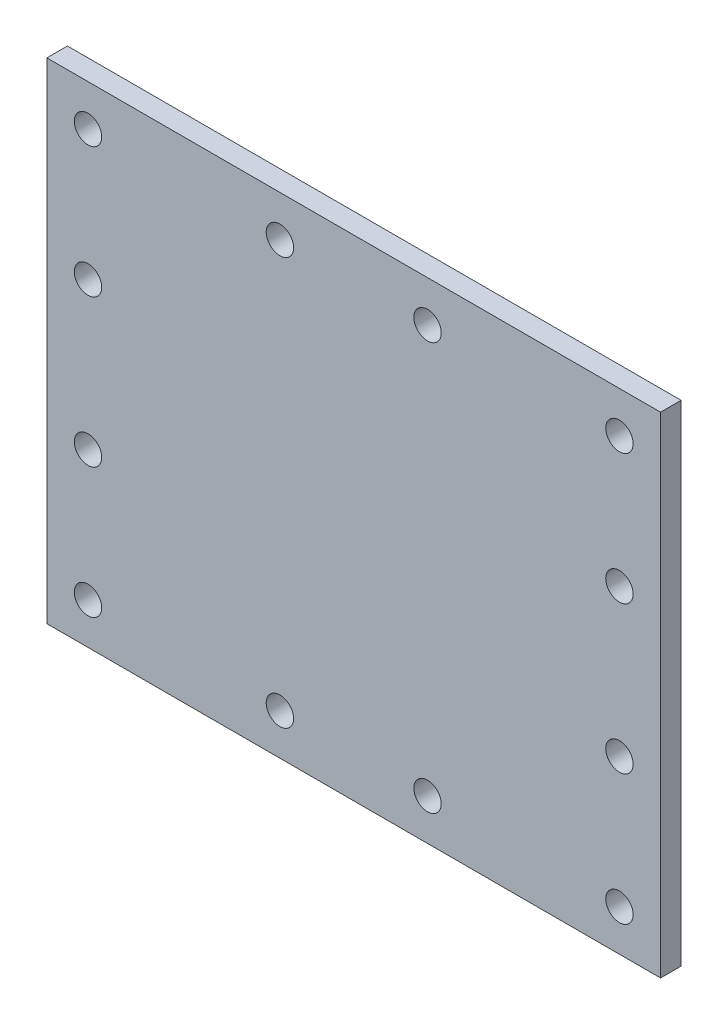
ISO-10303-21;
HEADER;
FILE_DESCRIPTION(('STEP AP214'),'2;1');
FILE_NAME('part.step','',(''),(''),'','','');
FILE_SCHEMA(('AUTOMOTIVE_DESIGN { 1 0 10303 214 1 1 1 1 }'));
ENDSEC;
DATA;
#1=APPLICATION_CONTEXT('core data for automotive mechanical design processes');
#2=APPLICATION_PROTOCOL_DEFINITION('international standard','automotive_design',2000,#1);
#3=PRODUCT_CONTEXT('',#1,'mechanical');
#4=PRODUCT('Part','Part','',(#3));
#5=PRODUCT_RELATED_PRODUCT_CATEGORY('part','',(#4));
#6=PRODUCT_DEFINITION_FORMATION('','',#4);
#7=PRODUCT_DEFINITION_CONTEXT('part definition',#1,'design');
#8=PRODUCT_DEFINITION('design','',#6,#7);
#9=PRODUCT_DEFINITION_SHAPE('','',#8);
#10=(LENGTH_UNIT() NAMED_UNIT(*) SI_UNIT(.MILLI.,.METRE.));
#11=(NAMED_UNIT(*) PLANE_ANGLE_UNIT() SI_UNIT($,.RADIAN.));
#12=(NAMED_UNIT(*) SI_UNIT($,.STERADIAN.) SOLID_ANGLE_UNIT());
#13=UNCERTAINTY_MEASURE_WITH_UNIT(LENGTH_MEASURE(1.E-05),#10,'distance_accuracy_value','');
#14=(GEOMETRIC_REPRESENTATION_CONTEXT(3) GLOBAL_UNCERTAINTY_ASSIGNED_CONTEXT((#13)) GLOBAL_UNIT_ASSIGNED_CONTEXT((#10,
#11,#12)) REPRESENTATION_CONTEXT('',''));
#15=CARTESIAN_POINT('',(0.,0.,0.));
#16=DIRECTION('',(0.,0.,1.));
#17=DIRECTION('',(1.,0.,0.));
#18=AXIS2_PLACEMENT_3D('',#15,#16,#17);
#19=CARTESIAN_POINT('',(-146.664312824647,106.741954424767,-2.51040500289528));
#20=DIRECTION('',(0.,1.,0.));
#21=DIRECTION('',(-1.,0.,0.));
#22=AXIS2_PLACEMENT_3D('',#19,#20,#21);
#23=PLANE('',#22);
#24=DIRECTION('',(1.,0.,0.));
#25=VECTOR('',#24,1.);
#26=CARTESIAN_POINT('',(-146.664312824647,106.741954424767,-5.51040500289528));
#27=LINE('',#26,#25);
#28=CARTESIAN_POINT('',(-146.664312824647,106.741954424767,-5.51040500289528));
#29=VERTEX_POINT('',#28);
#30=CARTESIAN_POINT('',(-57.1243128246472,106.741954424767,-5.51040500289528));
#31=VERTEX_POINT('',#30);
#32=EDGE_CURVE('E100',#29,#31,#27,.T.);
#33=ORIENTED_EDGE('',*,*,#32,.F.);
#34=DIRECTION('',(0.,0.,-1.));
#35=VECTOR('',#34,1.);
#36=CARTESIAN_POINT('',(-146.664312824647,106.741954424767,-2.51040500289528));
#37=LINE('',#36,#35);
#38=CARTESIAN_POINT('',(-146.664312824647,106.741954424767,-2.51040500289528));
#39=VERTEX_POINT('',#38);
#40=EDGE_CURVE('E11',#39,#29,#37,.T.);
#41=ORIENTED_EDGE('',*,*,#40,.F.);
#42=DIRECTION('',(1.,0.,0.));
#43=VECTOR('',#42,1.);
#44=CARTESIAN_POINT('',(-146.664312824647,106.741954424767,-2.51040500289528));
#45=LINE('',#44,#43);
#46=CARTESIAN_POINT('',(-57.1243128246472,106.741954424767,-2.51040500289528));
#47=VERTEX_POINT('',#46);
#48=EDGE_CURVE('E93',#39,#47,#45,.T.);
#49=ORIENTED_EDGE('',*,*,#48,.T.);
#50=DIRECTION('',(0.,0.,-1.));
#51=VECTOR('',#50,1.);
#52=CARTESIAN_POINT('',(-57.1243128246472,106.741954424767,-2.51040500289528));
#53=LINE('',#52,#51);
#54=EDGE_CURVE('E38',#47,#31,#53,.T.);
#55=ORIENTED_EDGE('',*,*,#54,.T.);
#56=EDGE_LOOP('',(#33,#41,#49,#55));
#57=FACE_BOUND('',#56,.T.);
#58=ADVANCED_FACE('F35',(#57),#23,.T.);
#59=CARTESIAN_POINT('',(-146.664312824647,35.2443544247679,-2.51040500289528));
#60=DIRECTION('',(-1.,0.,0.));
#61=DIRECTION('',(0.,0.,1.));
#62=AXIS2_PLACEMENT_3D('',#59,#60,#61);
#63=PLANE('',#62);
#64=DIRECTION('',(0.,1.,0.));
#65=VECTOR('',#64,1.);
#66=CARTESIAN_POINT('',(-146.664312824647,35.2443544247679,-5.51040500289528));
#67=LINE('',#66,#65);
#68=CARTESIAN_POINT('',(-146.664312824647,35.2443544247679,-5.51040500289528));
#69=VERTEX_POINT('',#68);
#70=EDGE_CURVE('E95',#69,#29,#67,.T.);
#71=ORIENTED_EDGE('',*,*,#70,.F.);
#72=DIRECTION('',(0.,0.,-1.));
#73=VECTOR('',#72,1.);
#74=CARTESIAN_POINT('',(-146.664312824647,35.2443544247679,-2.51040500289528));
#75=LINE('',#74,#73);
#76=CARTESIAN_POINT('',(-146.664312824647,35.2443544247679,-2.51040500289528));
#77=VERTEX_POINT('',#76);
#78=EDGE_CURVE('E44',#77,#69,#75,.T.);
#79=ORIENTED_EDGE('',*,*,#78,.F.);
#80=DIRECTION('',(0.,1.,0.));
#81=VECTOR('',#80,1.);
#82=CARTESIAN_POINT('',(-146.664312824647,35.2443544247679,-2.51040500289528));
#83=LINE('',#82,#81);
#84=EDGE_CURVE('E90',#77,#39,#83,.T.);
#85=ORIENTED_EDGE('',*,*,#84,.T.);
#86=ORIENTED_EDGE('',*,*,#40,.T.);
#87=EDGE_LOOP('',(#71,#79,#85,#86));
#88=FACE_BOUND('',#87,.T.);
#89=ADVANCED_FACE('F111',(#88),#63,.T.);
#90=CARTESIAN_POINT('',(-57.1243128246472,35.2443544247679,-2.51040500289528));
#91=DIRECTION('',(0.,-1.,0.));
#92=DIRECTION('',(1.,0.,0.));
#93=AXIS2_PLACEMENT_3D('',#90,#91,#92);
#94=PLANE('',#93);
#95=DIRECTION('',(-1.,0.,0.));
#96=VECTOR('',#95,1.);
#97=CARTESIAN_POINT('',(-57.1243128246472,35.2443544247679,-5.51040500289528));
#98=LINE('',#97,#96);
#99=CARTESIAN_POINT('',(-57.1243128246472,35.2443544247679,-5.51040500289528));
#100=VERTEX_POINT('',#99);
#101=EDGE_CURVE('E85',#100,#69,#98,.T.);
#102=ORIENTED_EDGE('',*,*,#101,.F.);
#103=DIRECTION('',(0.,0.,-1.));
#104=VECTOR('',#103,1.);
#105=CARTESIAN_POINT('',(-57.1243128246472,35.2443544247679,-2.51040500289528));
#106=LINE('',#105,#104);
#107=CARTESIAN_POINT('',(-57.1243128246472,35.2443544247679,-2.51040500289528));
#108=VERTEX_POINT('',#107);
#109=EDGE_CURVE('E80',#108,#100,#106,.T.);
#110=ORIENTED_EDGE('',*,*,#109,.F.);
#111=DIRECTION('',(-1.,0.,0.));
#112=VECTOR('',#111,1.);
#113=CARTESIAN_POINT('',(-57.1243128246472,35.2443544247679,-2.51040500289528));
#114=LINE('',#113,#112);
#115=EDGE_CURVE('E83',#108,#77,#114,.T.);
#116=ORIENTED_EDGE('',*,*,#115,.T.);
#117=ORIENTED_EDGE('',*,*,#78,.T.);
#118=EDGE_LOOP('',(#102,#110,#116,#117));
#119=FACE_BOUND('',#118,.T.);
#120=ADVANCED_FACE('F82',(#119),#94,.T.);
#121=CARTESIAN_POINT('',(-57.1243128246472,106.741954424767,-2.51040500289528));
#122=DIRECTION('',(1.,0.,0.));
#123=DIRECTION('',(0.,1.,0.));
#124=AXIS2_PLACEMENT_3D('',#121,#122,#123);
#125=PLANE('',#124);
#126=DIRECTION('',(0.,-1.,0.));
#127=VECTOR('',#126,1.);
#128=CARTESIAN_POINT('',(-57.1243128246472,106.741954424767,-5.51040500289528));
#129=LINE('',#128,#127);
#130=EDGE_CURVE('E103',#31,#100,#129,.T.);
#131=ORIENTED_EDGE('',*,*,#130,.F.);
#132=ORIENTED_EDGE('',*,*,#54,.F.);
#133=DIRECTION('',(0.,-1.,0.));
#134=VECTOR('',#133,1.);
#135=CARTESIAN_POINT('',(-57.1243128246472,106.741954424767,-2.51040500289528));
#136=LINE('',#135,#134);
#137=EDGE_CURVE('E89',#47,#108,#136,.T.);
#138=ORIENTED_EDGE('',*,*,#137,.T.);
#139=ORIENTED_EDGE('',*,*,#109,.T.);
#140=EDGE_LOOP('',(#131,#132,#138,#139));
#141=FACE_BOUND('',#140,.T.);
#142=ADVANCED_FACE('F92',(#141),#125,.T.);
#143=CARTESIAN_POINT('',(0.,0.,-2.51040500289528));
#144=DIRECTION('',(0.,0.,-1.));
#145=DIRECTION('',(-1.,0.,0.));
#146=AXIS2_PLACEMENT_3D('',#143,#144,#145);
#147=PLANE('',#146);
#148=CARTESIAN_POINT('',(-112.664312824647,100.741954424767,-2.51040500289528));
#149=DIRECTION('',(0.,0.,-1.));
#150=DIRECTION('',(-1.,0.,0.));
#151=AXIS2_PLACEMENT_3D('',#148,#149,#150);
#152=CIRCLE('',#151,2.);
#153=CARTESIAN_POINT('',(-114.664312824647,100.741954424767,-2.51040500289528));
#154=VERTEX_POINT('',#153);
#155=EDGE_CURVE('E184',#154,#154,#152,.T.);
#156=ORIENTED_EDGE('',*,*,#155,.T.);
#157=EDGE_LOOP('',(#156));
#158=FACE_BOUND('',#157,.T.);
#159=CARTESIAN_POINT('',(-91.1243128246472,100.741954424767,-2.51040500289528));
#160=DIRECTION('',(0.,0.,-1.));
#161=DIRECTION('',(-1.,0.,0.));
#162=AXIS2_PLACEMENT_3D('',#159,#160,#161);
#163=CIRCLE('',#162,2.);
#164=CARTESIAN_POINT('',(-93.1243128246472,100.741954424767,-2.51040500289528));
#165=VERTEX_POINT('',#164);
#166=EDGE_CURVE('E192',#165,#165,#163,.T.);
#167=ORIENTED_EDGE('',*,*,#166,.T.);
#168=EDGE_LOOP('',(#167));
#169=FACE_BOUND('',#168,.T.);
#170=CARTESIAN_POINT('',(-63.1243128246472,100.741954424767,-2.51040500289528));
#171=DIRECTION('',(0.,0.,-1.));
#172=DIRECTION('',(-1.,0.,0.));
#173=AXIS2_PLACEMENT_3D('',#170,#171,#172);
#174=CIRCLE('',#173,1.99999999999998);
#175=CARTESIAN_POINT('',(-65.1243128246472,100.741954424767,-2.51040500289528));
#176=VERTEX_POINT('',#175);
#177=EDGE_CURVE('E198',#176,#176,#174,.T.);
#178=ORIENTED_EDGE('',*,*,#177,.T.);
#179=EDGE_LOOP('',(#178));
#180=FACE_BOUND('',#179,.T.);
#181=CARTESIAN_POINT('',(-63.1243128246471,81.7419544247674,-2.51040500289528));
#182=DIRECTION('',(0.,0.,-1.));
#183=DIRECTION('',(-1.,0.,0.));
#184=AXIS2_PLACEMENT_3D('',#181,#182,#183);
#185=CIRCLE('',#184,1.99999999999998);
#186=CARTESIAN_POINT('',(-65.1243128246471,81.7419544247674,-2.51040500289528));
#187=VERTEX_POINT('',#186);
#188=EDGE_CURVE('E204',#187,#187,#185,.T.);
#189=ORIENTED_EDGE('',*,*,#188,.T.);
#190=EDGE_LOOP('',(#189));
#191=FACE_BOUND('',#190,.T.);
#192=CARTESIAN_POINT('',(-63.1243128246471,60.2443544247679,-2.51040500289528));
#193=DIRECTION('',(0.,0.,-1.));
#194=DIRECTION('',(-1.,0.,0.));
#195=AXIS2_PLACEMENT_3D('',#192,#193,#194);
#196=CIRCLE('',#195,1.99999999999998);
#197=CARTESIAN_POINT('',(-65.1243128246471,60.2443544247679,-2.51040500289528));
#198=VERTEX_POINT('',#197);
#199=EDGE_CURVE('E210',#198,#198,#196,.T.);
#200=ORIENTED_EDGE('',*,*,#199,.T.);
#201=EDGE_LOOP('',(#200));
#202=FACE_BOUND('',#201,.T.);
#203=CARTESIAN_POINT('',(-63.1243128246472,41.2443544247679,-2.51040500289528));
#204=DIRECTION('',(0.,0.,-1.));
#205=DIRECTION('',(-1.,0.,0.));
#206=AXIS2_PLACEMENT_3D('',#203,#204,#205);
#207=CIRCLE('',#206,1.99999999999998);
#208=CARTESIAN_POINT('',(-65.1243128246472,41.2443544247679,-2.51040500289528));
#209=VERTEX_POINT('',#208);
#210=EDGE_CURVE('E216',#209,#209,#207,.T.);
#211=ORIENTED_EDGE('',*,*,#210,.T.);
#212=EDGE_LOOP('',(#211));
#213=FACE_BOUND('',#212,.T.);
#214=CARTESIAN_POINT('',(-91.1243128246472,41.2443544247679,-2.51040500289528));
#215=DIRECTION('',(0.,0.,-1.));
#216=DIRECTION('',(-1.,0.,0.));
#217=AXIS2_PLACEMENT_3D('',#214,#215,#216);
#218=CIRCLE('',#217,2.);
#219=CARTESIAN_POINT('',(-93.1243128246472,41.2443544247679,-2.51040500289528));
#220=VERTEX_POINT('',#219);
#221=EDGE_CURVE('E222',#220,#220,#218,.T.);
#222=ORIENTED_EDGE('',*,*,#221,.T.);
#223=EDGE_LOOP('',(#222));
#224=FACE_BOUND('',#223,.T.);
#225=CARTESIAN_POINT('',(-112.664312824647,41.2443544247679,-2.51040500289528));
#226=DIRECTION('',(0.,0.,-1.));
#227=DIRECTION('',(-1.,0.,0.));
#228=AXIS2_PLACEMENT_3D('',#225,#226,#227);
#229=CIRCLE('',#228,2.);
#230=CARTESIAN_POINT('',(-114.664312824647,41.2443544247679,-2.51040500289528));
#231=VERTEX_POINT('',#230);
#232=EDGE_CURVE('E228',#231,#231,#229,.T.);
#233=ORIENTED_EDGE('',*,*,#232,.T.);
#234=EDGE_LOOP('',(#233));
#235=FACE_BOUND('',#234,.T.);
#236=CARTESIAN_POINT('',(-140.664312824647,41.2443544247679,-2.51040500289528));
#237=DIRECTION('',(0.,0.,-1.));
#238=DIRECTION('',(-1.,0.,0.));
#239=AXIS2_PLACEMENT_3D('',#236,#237,#238);
#240=CIRCLE('',#239,2.);
#241=CARTESIAN_POINT('',(-142.664312824647,41.2443544247679,-2.51040500289528));
#242=VERTEX_POINT('',#241);
#243=EDGE_CURVE('E234',#242,#242,#240,.T.);
#244=ORIENTED_EDGE('',*,*,#243,.T.);
#245=EDGE_LOOP('',(#244));
#246=FACE_BOUND('',#245,.T.);
#247=CARTESIAN_POINT('',(-140.664312824647,60.2443544247679,-2.51040500289528));
#248=DIRECTION('',(0.,0.,-1.));
#249=DIRECTION('',(-1.,0.,0.));
#250=AXIS2_PLACEMENT_3D('',#247,#248,#249);
#251=CIRCLE('',#250,2.);
#252=CARTESIAN_POINT('',(-142.664312824647,60.2443544247679,-2.51040500289528));
#253=VERTEX_POINT('',#252);
#254=EDGE_CURVE('E240',#253,#253,#251,.T.);
#255=ORIENTED_EDGE('',*,*,#254,.T.);
#256=EDGE_LOOP('',(#255));
#257=FACE_BOUND('',#256,.T.);
#258=CARTESIAN_POINT('',(-140.664312824647,100.741954424767,-2.51040500289528));
#259=DIRECTION('',(0.,0.,-1.));
#260=DIRECTION('',(-1.,0.,0.));
#261=AXIS2_PLACEMENT_3D('',#258,#259,#260);
#262=CIRCLE('',#261,2.);
#263=CARTESIAN_POINT('',(-142.664312824647,100.741954424767,-2.51040500289528));
#264=VERTEX_POINT('',#263);
#265=EDGE_CURVE('E246',#264,#264,#262,.T.);
#266=ORIENTED_EDGE('',*,*,#265,.T.);
#267=EDGE_LOOP('',(#266));
#268=FACE_BOUND('',#267,.T.);
#269=CARTESIAN_POINT('',(-140.664312824647,81.7419544247674,-2.51040500289528));
#270=DIRECTION('',(0.,0.,-1.));
#271=DIRECTION('',(-1.,0.,0.));
#272=AXIS2_PLACEMENT_3D('',#269,#270,#271);
#273=CIRCLE('',#272,2.);
#274=CARTESIAN_POINT('',(-142.664312824647,81.7419544247674,-2.51040500289528));
#275=VERTEX_POINT('',#274);
#276=EDGE_CURVE('E104',#275,#275,#273,.T.);
#277=ORIENTED_EDGE('',*,*,#276,.T.);
#278=EDGE_LOOP('',(#277));
#279=FACE_BOUND('',#278,.T.);
#280=ORIENTED_EDGE('',*,*,#48,.F.);
#281=ORIENTED_EDGE('',*,*,#84,.F.);
#282=ORIENTED_EDGE('',*,*,#115,.F.);
#283=ORIENTED_EDGE('',*,*,#137,.F.);
#284=EDGE_LOOP('',(#280,#281,#282,#283));
#285=FACE_BOUND('',#284,.T.);
#286=ADVANCED_FACE('F88',(#158,#169,#180,#191,#202,#213,#224,#235,#246,#257,#268,#279,#285),
#147,.F.);
#287=CARTESIAN_POINT('',(0.,0.,-5.51040500289528));
#288=DIRECTION('',(0.,0.,-1.));
#289=DIRECTION('',(-1.,0.,0.));
#290=AXIS2_PLACEMENT_3D('',#287,#288,#289);
#291=PLANE('',#290);
#292=CARTESIAN_POINT('',(-112.664312824647,100.741954424767,-5.51040500289528));
#293=DIRECTION('',(0.,0.,-1.));
#294=DIRECTION('',(-1.,0.,0.));
#295=AXIS2_PLACEMENT_3D('',#292,#293,#294);
#296=CIRCLE('',#295,2.);
#297=CARTESIAN_POINT('',(-114.664312824647,100.741954424767,-5.51040500289528));
#298=VERTEX_POINT('',#297);
#299=EDGE_CURVE('E187',#298,#298,#296,.T.);
#300=ORIENTED_EDGE('',*,*,#299,.F.);
#301=EDGE_LOOP('',(#300));
#302=FACE_BOUND('',#301,.T.);
#303=CARTESIAN_POINT('',(-91.1243128246472,100.741954424767,-5.51040500289528));
#304=DIRECTION('',(0.,0.,-1.));
#305=DIRECTION('',(-1.,0.,0.));
#306=AXIS2_PLACEMENT_3D('',#303,#304,#305);
#307=CIRCLE('',#306,2.);
#308=CARTESIAN_POINT('',(-93.1243128246472,100.741954424767,-5.51040500289528));
#309=VERTEX_POINT('',#308);
#310=EDGE_CURVE('E189',#309,#309,#307,.T.);
#311=ORIENTED_EDGE('',*,*,#310,.F.);
#312=EDGE_LOOP('',(#311));
#313=FACE_BOUND('',#312,.T.);
#314=CARTESIAN_POINT('',(-63.1243128246472,100.741954424767,-5.51040500289528));
#315=DIRECTION('',(0.,0.,-1.));
#316=DIRECTION('',(-1.,0.,0.));
#317=AXIS2_PLACEMENT_3D('',#314,#315,#316);
#318=CIRCLE('',#317,1.99999999999998);
#319=CARTESIAN_POINT('',(-65.1243128246472,100.741954424767,-5.51040500289528));
#320=VERTEX_POINT('',#319);
#321=EDGE_CURVE('E195',#320,#320,#318,.T.);
#322=ORIENTED_EDGE('',*,*,#321,.F.);
#323=EDGE_LOOP('',(#322));
#324=FACE_BOUND('',#323,.T.);
#325=CARTESIAN_POINT('',(-63.1243128246471,81.7419544247674,-5.51040500289528));
#326=DIRECTION('',(0.,0.,-1.));
#327=DIRECTION('',(-1.,0.,0.));
#328=AXIS2_PLACEMENT_3D('',#325,#326,#327);
#329=CIRCLE('',#328,1.99999999999998);
#330=CARTESIAN_POINT('',(-65.1243128246471,81.7419544247674,-5.51040500289528));
#331=VERTEX_POINT('',#330);
#332=EDGE_CURVE('E201',#331,#331,#329,.T.);
#333=ORIENTED_EDGE('',*,*,#332,.F.);
#334=EDGE_LOOP('',(#333));
#335=FACE_BOUND('',#334,.T.);
#336=CARTESIAN_POINT('',(-63.1243128246471,60.2443544247679,-5.51040500289528));
#337=DIRECTION('',(0.,0.,-1.));
#338=DIRECTION('',(-1.,0.,0.));
#339=AXIS2_PLACEMENT_3D('',#336,#337,#338);
#340=CIRCLE('',#339,1.99999999999998);
#341=CARTESIAN_POINT('',(-65.1243128246471,60.2443544247679,-5.51040500289528));
#342=VERTEX_POINT('',#341);
#343=EDGE_CURVE('E207',#342,#342,#340,.T.);
#344=ORIENTED_EDGE('',*,*,#343,.F.);
#345=EDGE_LOOP('',(#344));
#346=FACE_BOUND('',#345,.T.);
#347=CARTESIAN_POINT('',(-63.1243128246472,41.2443544247679,-5.51040500289528));
#348=DIRECTION('',(0.,0.,-1.));
#349=DIRECTION('',(-1.,0.,0.));
#350=AXIS2_PLACEMENT_3D('',#347,#348,#349);
#351=CIRCLE('',#350,1.99999999999998);
#352=CARTESIAN_POINT('',(-65.1243128246472,41.2443544247679,-5.51040500289528));
#353=VERTEX_POINT('',#352);
#354=EDGE_CURVE('E213',#353,#353,#351,.T.);
#355=ORIENTED_EDGE('',*,*,#354,.F.);
#356=EDGE_LOOP('',(#355));
#357=FACE_BOUND('',#356,.T.);
#358=CARTESIAN_POINT('',(-91.1243128246472,41.2443544247679,-5.51040500289528));
#359=DIRECTION('',(0.,0.,-1.));
#360=DIRECTION('',(-1.,0.,0.));
#361=AXIS2_PLACEMENT_3D('',#358,#359,#360);
#362=CIRCLE('',#361,2.);
#363=CARTESIAN_POINT('',(-93.1243128246472,41.2443544247679,-5.51040500289528));
#364=VERTEX_POINT('',#363);
#365=EDGE_CURVE('E219',#364,#364,#362,.T.);
#366=ORIENTED_EDGE('',*,*,#365,.F.);
#367=EDGE_LOOP('',(#366));
#368=FACE_BOUND('',#367,.T.);
#369=CARTESIAN_POINT('',(-112.664312824647,41.2443544247679,-5.51040500289528));
#370=DIRECTION('',(0.,0.,-1.));
#371=DIRECTION('',(-1.,0.,0.));
#372=AXIS2_PLACEMENT_3D('',#369,#370,#371);
#373=CIRCLE('',#372,2.);
#374=CARTESIAN_POINT('',(-114.664312824647,41.2443544247679,-5.51040500289528));
#375=VERTEX_POINT('',#374);
#376=EDGE_CURVE('E225',#375,#375,#373,.T.);
#377=ORIENTED_EDGE('',*,*,#376,.F.);
#378=EDGE_LOOP('',(#377));
#379=FACE_BOUND('',#378,.T.);
#380=CARTESIAN_POINT('',(-140.664312824647,41.2443544247679,-5.51040500289528));
#381=DIRECTION('',(0.,0.,-1.));
#382=DIRECTION('',(-1.,0.,0.));
#383=AXIS2_PLACEMENT_3D('',#380,#381,#382);
#384=CIRCLE('',#383,2.);
#385=CARTESIAN_POINT('',(-142.664312824647,41.2443544247679,-5.51040500289528));
#386=VERTEX_POINT('',#385);
#387=EDGE_CURVE('E231',#386,#386,#384,.T.);
#388=ORIENTED_EDGE('',*,*,#387,.F.);
#389=EDGE_LOOP('',(#388));
#390=FACE_BOUND('',#389,.T.);
#391=CARTESIAN_POINT('',(-140.664312824647,60.2443544247679,-5.51040500289528));
#392=DIRECTION('',(0.,0.,-1.));
#393=DIRECTION('',(-1.,0.,0.));
#394=AXIS2_PLACEMENT_3D('',#391,#392,#393);
#395=CIRCLE('',#394,2.);
#396=CARTESIAN_POINT('',(-142.664312824647,60.2443544247679,-5.51040500289528));
#397=VERTEX_POINT('',#396);
#398=EDGE_CURVE('E237',#397,#397,#395,.T.);
#399=ORIENTED_EDGE('',*,*,#398,.F.);
#400=EDGE_LOOP('',(#399));
#401=FACE_BOUND('',#400,.T.);
#402=CARTESIAN_POINT('',(-140.664312824647,100.741954424767,-5.51040500289528));
#403=DIRECTION('',(0.,0.,-1.));
#404=DIRECTION('',(-1.,0.,0.));
#405=AXIS2_PLACEMENT_3D('',#402,#403,#404);
#406=CIRCLE('',#405,2.);
#407=CARTESIAN_POINT('',(-142.664312824647,100.741954424767,-5.51040500289528));
#408=VERTEX_POINT('',#407);
#409=EDGE_CURVE('E243',#408,#408,#406,.T.);
#410=ORIENTED_EDGE('',*,*,#409,.F.);
#411=EDGE_LOOP('',(#410));
#412=FACE_BOUND('',#411,.T.);
#413=CARTESIAN_POINT('',(-140.664312824647,81.7419544247674,-5.51040500289528));
#414=DIRECTION('',(0.,0.,-1.));
#415=DIRECTION('',(-1.,0.,0.));
#416=AXIS2_PLACEMENT_3D('',#413,#414,#415);
#417=CIRCLE('',#416,2.);
#418=CARTESIAN_POINT('',(-142.664312824647,81.7419544247674,-5.51040500289528));
#419=VERTEX_POINT('',#418);
#420=EDGE_CURVE('E249',#419,#419,#417,.T.);
#421=ORIENTED_EDGE('',*,*,#420,.F.);
#422=EDGE_LOOP('',(#421));
#423=FACE_BOUND('',#422,.T.);
#424=ORIENTED_EDGE('',*,*,#32,.T.);
#425=ORIENTED_EDGE('',*,*,#130,.T.);
#426=ORIENTED_EDGE('',*,*,#101,.T.);
#427=ORIENTED_EDGE('',*,*,#70,.T.);
#428=EDGE_LOOP('',(#424,#425,#426,#427));
#429=FACE_BOUND('',#428,.T.);
#430=ADVANCED_FACE('F110',(#302,#313,#324,#335,#346,#357,#368,#379,#390,#401,#412,#423,#429),
#291,.T.);
#431=CARTESIAN_POINT('',(-140.664312824647,81.7419544247674,-2.51040500289528));
#432=DIRECTION('',(0.,0.,-1.));
#433=DIRECTION('',(-1.,0.,0.));
#434=AXIS2_PLACEMENT_3D('',#431,#432,#433);
#435=CYLINDRICAL_SURFACE('',#434,2.);
#436=ORIENTED_EDGE('',*,*,#276,.F.);
#437=EDGE_LOOP('',(#436));
#438=FACE_BOUND('',#437,.T.);
#439=ORIENTED_EDGE('',*,*,#420,.T.);
#440=EDGE_LOOP('',(#439));
#441=FACE_BOUND('',#440,.T.);
#442=ADVANCED_FACE('F129',(#438,#441),#435,.F.);
#443=CARTESIAN_POINT('',(-140.664312824647,100.741954424767,-2.51040500289528));
#444=DIRECTION('',(0.,0.,-1.));
#445=DIRECTION('',(-1.,0.,0.));
#446=AXIS2_PLACEMENT_3D('',#443,#444,#445);
#447=CYLINDRICAL_SURFACE('',#446,2.);
#448=ORIENTED_EDGE('',*,*,#265,.F.);
#449=EDGE_LOOP('',(#448));
#450=FACE_BOUND('',#449,.T.);
#451=ORIENTED_EDGE('',*,*,#409,.T.);
#452=EDGE_LOOP('',(#451));
#453=FACE_BOUND('',#452,.T.);
#454=ADVANCED_FACE('F136',(#450,#453),#447,.F.);
#455=CARTESIAN_POINT('',(-140.664312824647,60.2443544247679,-2.51040500289528));
#456=DIRECTION('',(0.,0.,-1.));
#457=DIRECTION('',(-1.,0.,0.));
#458=AXIS2_PLACEMENT_3D('',#455,#456,#457);
#459=CYLINDRICAL_SURFACE('',#458,2.);
#460=ORIENTED_EDGE('',*,*,#254,.F.);
#461=EDGE_LOOP('',(#460));
#462=FACE_BOUND('',#461,.T.);
#463=ORIENTED_EDGE('',*,*,#398,.T.);
#464=EDGE_LOOP('',(#463));
#465=FACE_BOUND('',#464,.T.);
#466=ADVANCED_FACE('F140',(#462,#465),#459,.F.);
#467=CARTESIAN_POINT('',(-140.664312824647,41.2443544247679,-2.51040500289528));
#468=DIRECTION('',(0.,0.,-1.));
#469=DIRECTION('',(-1.,0.,0.));
#470=AXIS2_PLACEMENT_3D('',#467,#468,#469);
#471=CYLINDRICAL_SURFACE('',#470,2.);
#472=ORIENTED_EDGE('',*,*,#243,.F.);
#473=EDGE_LOOP('',(#472));
#474=FACE_BOUND('',#473,.T.);
#475=ORIENTED_EDGE('',*,*,#387,.T.);
#476=EDGE_LOOP('',(#475));
#477=FACE_BOUND('',#476,.T.);
#478=ADVANCED_FACE('F144',(#474,#477),#471,.F.);
#479=CARTESIAN_POINT('',(-112.664312824647,41.2443544247679,-2.51040500289528));
#480=DIRECTION('',(0.,0.,-1.));
#481=DIRECTION('',(-1.,0.,0.));
#482=AXIS2_PLACEMENT_3D('',#479,#480,#481);
#483=CYLINDRICAL_SURFACE('',#482,2.);
#484=ORIENTED_EDGE('',*,*,#232,.F.);
#485=EDGE_LOOP('',(#484));
#486=FACE_BOUND('',#485,.T.);
#487=ORIENTED_EDGE('',*,*,#376,.T.);
#488=EDGE_LOOP('',(#487));
#489=FACE_BOUND('',#488,.T.);
#490=ADVANCED_FACE('F148',(#486,#489),#483,.F.);
#491=CARTESIAN_POINT('',(-91.1243128246472,41.2443544247679,-2.51040500289528));
#492=DIRECTION('',(0.,0.,-1.));
#493=DIRECTION('',(-1.,0.,0.));
#494=AXIS2_PLACEMENT_3D('',#491,#492,#493);
#495=CYLINDRICAL_SURFACE('',#494,2.);
#496=ORIENTED_EDGE('',*,*,#221,.F.);
#497=EDGE_LOOP('',(#496));
#498=FACE_BOUND('',#497,.T.);
#499=ORIENTED_EDGE('',*,*,#365,.T.);
#500=EDGE_LOOP('',(#499));
#501=FACE_BOUND('',#500,.T.);
#502=ADVANCED_FACE('F152',(#498,#501),#495,.F.);
#503=CARTESIAN_POINT('',(-63.1243128246472,41.2443544247679,-2.51040500289528));
#504=DIRECTION('',(0.,0.,-1.));
#505=DIRECTION('',(-1.,0.,0.));
#506=AXIS2_PLACEMENT_3D('',#503,#504,#505);
#507=CYLINDRICAL_SURFACE('',#506,1.99999999999998);
#508=ORIENTED_EDGE('',*,*,#210,.F.);
#509=EDGE_LOOP('',(#508));
#510=FACE_BOUND('',#509,.T.);
#511=ORIENTED_EDGE('',*,*,#354,.T.);
#512=EDGE_LOOP('',(#511));
#513=FACE_BOUND('',#512,.T.);
#514=ADVANCED_FACE('F156',(#510,#513),#507,.F.);
#515=CARTESIAN_POINT('',(-63.1243128246471,60.2443544247679,-2.51040500289528));
#516=DIRECTION('',(0.,0.,-1.));
#517=DIRECTION('',(-1.,0.,0.));
#518=AXIS2_PLACEMENT_3D('',#515,#516,#517);
#519=CYLINDRICAL_SURFACE('',#518,1.99999999999998);
#520=ORIENTED_EDGE('',*,*,#199,.F.);
#521=EDGE_LOOP('',(#520));
#522=FACE_BOUND('',#521,.T.);
#523=ORIENTED_EDGE('',*,*,#343,.T.);
#524=EDGE_LOOP('',(#523));
#525=FACE_BOUND('',#524,.T.);
#526=ADVANCED_FACE('F160',(#522,#525),#519,.F.);
#527=CARTESIAN_POINT('',(-63.1243128246471,81.7419544247674,-2.51040500289528));
#528=DIRECTION('',(0.,0.,-1.));
#529=DIRECTION('',(-1.,0.,0.));
#530=AXIS2_PLACEMENT_3D('',#527,#528,#529);
#531=CYLINDRICAL_SURFACE('',#530,1.99999999999998);
#532=ORIENTED_EDGE('',*,*,#188,.F.);
#533=EDGE_LOOP('',(#532));
#534=FACE_BOUND('',#533,.T.);
#535=ORIENTED_EDGE('',*,*,#332,.T.);
#536=EDGE_LOOP('',(#535));
#537=FACE_BOUND('',#536,.T.);
#538=ADVANCED_FACE('F164',(#534,#537),#531,.F.);
#539=CARTESIAN_POINT('',(-63.1243128246472,100.741954424767,-2.51040500289528));
#540=DIRECTION('',(0.,0.,-1.));
#541=DIRECTION('',(-1.,0.,0.));
#542=AXIS2_PLACEMENT_3D('',#539,#540,#541);
#543=CYLINDRICAL_SURFACE('',#542,1.99999999999998);
#544=ORIENTED_EDGE('',*,*,#177,.F.);
#545=EDGE_LOOP('',(#544));
#546=FACE_BOUND('',#545,.T.);
#547=ORIENTED_EDGE('',*,*,#321,.T.);
#548=EDGE_LOOP('',(#547));
#549=FACE_BOUND('',#548,.T.);
#550=ADVANCED_FACE('F168',(#546,#549),#543,.F.);
#551=CARTESIAN_POINT('',(-91.1243128246472,100.741954424767,-2.51040500289528));
#552=DIRECTION('',(0.,0.,-1.));
#553=DIRECTION('',(-1.,0.,0.));
#554=AXIS2_PLACEMENT_3D('',#551,#552,#553);
#555=CYLINDRICAL_SURFACE('',#554,2.);
#556=ORIENTED_EDGE('',*,*,#166,.F.);
#557=EDGE_LOOP('',(#556));
#558=FACE_BOUND('',#557,.T.);
#559=ORIENTED_EDGE('',*,*,#310,.T.);
#560=EDGE_LOOP('',(#559));
#561=FACE_BOUND('',#560,.T.);
#562=ADVANCED_FACE('F172',(#558,#561),#555,.F.);
#563=CARTESIAN_POINT('',(-112.664312824647,100.741954424767,-2.51040500289528));
#564=DIRECTION('',(0.,0.,-1.));
#565=DIRECTION('',(-1.,0.,0.));
#566=AXIS2_PLACEMENT_3D('',#563,#564,#565);
#567=CYLINDRICAL_SURFACE('',#566,2.);
#568=ORIENTED_EDGE('',*,*,#155,.F.);
#569=EDGE_LOOP('',(#568));
#570=FACE_BOUND('',#569,.T.);
#571=ORIENTED_EDGE('',*,*,#299,.T.);
#572=EDGE_LOOP('',(#571));
#573=FACE_BOUND('',#572,.T.);
#574=ADVANCED_FACE('F176',(#570,#573),#567,.F.);
#575=CLOSED_SHELL('',(#58,#89,#120,#142,#286,#430,#442,#454,#466,#478,#490,#502,#514,#526,#538,
#550,#562,#574));
#576=MANIFOLD_SOLID_BREP('B2',#575);
#577=ADVANCED_BREP_SHAPE_REPRESENTATION('',(#18,#576),#14);
#578=SHAPE_DEFINITION_REPRESENTATION(#9,#577);
ENDSEC;
END-ISO-10303-21;
